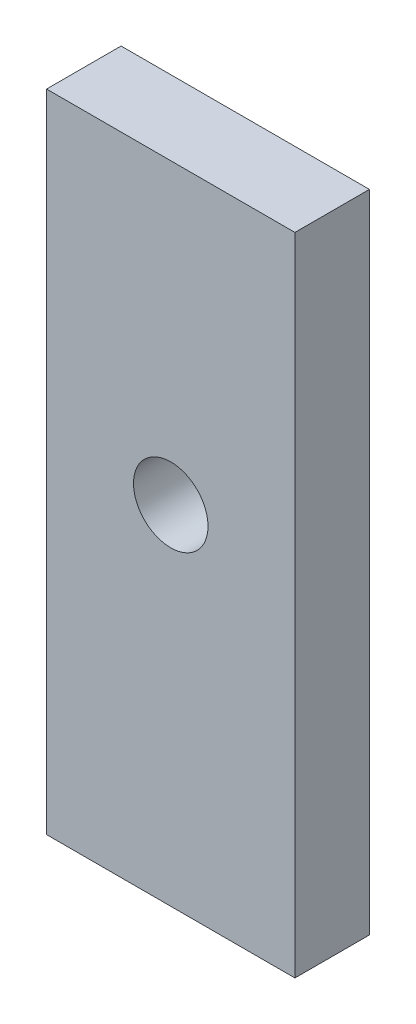
ISO-10303-21;
HEADER;
FILE_DESCRIPTION(('STEP AP214'),'2;1');
FILE_NAME('part.step','',(''),(''),'','','');
FILE_SCHEMA(('AUTOMOTIVE_DESIGN { 1 0 10303 214 1 1 1 1 }'));
ENDSEC;
DATA;
#1=APPLICATION_CONTEXT('core data for automotive mechanical design processes');
#2=APPLICATION_PROTOCOL_DEFINITION('international standard','automotive_design',2000,#1);
#3=PRODUCT_CONTEXT('',#1,'mechanical');
#4=PRODUCT('Part','Part','',(#3));
#5=PRODUCT_RELATED_PRODUCT_CATEGORY('part','',(#4));
#6=PRODUCT_DEFINITION_FORMATION('','',#4);
#7=PRODUCT_DEFINITION_CONTEXT('part definition',#1,'design');
#8=PRODUCT_DEFINITION('design','',#6,#7);
#9=PRODUCT_DEFINITION_SHAPE('','',#8);
#10=(LENGTH_UNIT() NAMED_UNIT(*) SI_UNIT(.MILLI.,.METRE.));
#11=(NAMED_UNIT(*) PLANE_ANGLE_UNIT() SI_UNIT($,.RADIAN.));
#12=(NAMED_UNIT(*) SI_UNIT($,.STERADIAN.) SOLID_ANGLE_UNIT());
#13=UNCERTAINTY_MEASURE_WITH_UNIT(LENGTH_MEASURE(1.E-05),#10,'distance_accuracy_value','');
#14=(GEOMETRIC_REPRESENTATION_CONTEXT(3) GLOBAL_UNCERTAINTY_ASSIGNED_CONTEXT((#13)) GLOBAL_UNIT_ASSIGNED_CONTEXT((#10,
#11,#12)) REPRESENTATION_CONTEXT('',''));
#15=CARTESIAN_POINT('',(0.,0.,0.));
#16=DIRECTION('',(0.,0.,1.));
#17=DIRECTION('',(1.,0.,0.));
#18=AXIS2_PLACEMENT_3D('',#15,#16,#17);
#19=CARTESIAN_POINT('',(0.,0.,3.));
#20=DIRECTION('',(1.,0.,0.));
#21=DIRECTION('',(0.,1.,0.));
#22=AXIS2_PLACEMENT_3D('',#19,#20,#21);
#23=PLANE('',#22);
#24=DIRECTION('',(0.,-1.,0.));
#25=VECTOR('',#24,1.);
#26=CARTESIAN_POINT('',(0.,0.,0.));
#27=LINE('',#26,#25);
#28=CARTESIAN_POINT('',(0.,26.,0.));
#29=VERTEX_POINT('',#28);
#30=CARTESIAN_POINT('',(0.,0.,0.));
#31=VERTEX_POINT('',#30);
#32=EDGE_CURVE('E98',#29,#31,#27,.T.);
#33=ORIENTED_EDGE('',*,*,#32,.T.);
#34=DIRECTION('',(0.,0.,-1.));
#35=VECTOR('',#34,1.);
#36=CARTESIAN_POINT('',(0.,0.,3.));
#37=LINE('',#36,#35);
#38=CARTESIAN_POINT('',(0.,0.,3.));
#39=VERTEX_POINT('',#38);
#40=EDGE_CURVE('E11',#39,#31,#37,.T.);
#41=ORIENTED_EDGE('',*,*,#40,.F.);
#42=DIRECTION('',(0.,-1.,0.));
#43=VECTOR('',#42,1.);
#44=CARTESIAN_POINT('',(0.,0.,3.));
#45=LINE('',#44,#43);
#46=CARTESIAN_POINT('',(0.,26.,3.));
#47=VERTEX_POINT('',#46);
#48=EDGE_CURVE('E86',#47,#39,#45,.T.);
#49=ORIENTED_EDGE('',*,*,#48,.F.);
#50=DIRECTION('',(0.,0.,-1.));
#51=VECTOR('',#50,1.);
#52=CARTESIAN_POINT('',(0.,26.,3.));
#53=LINE('',#52,#51);
#54=EDGE_CURVE('E94',#47,#29,#53,.T.);
#55=ORIENTED_EDGE('',*,*,#54,.T.);
#56=EDGE_LOOP('',(#33,#41,#49,#55));
#57=FACE_BOUND('',#56,.T.);
#58=ADVANCED_FACE('F35',(#57),#23,.F.);
#59=CARTESIAN_POINT('',(0.,0.,3.));
#60=DIRECTION('',(0.,1.,0.));
#61=DIRECTION('',(-1.,0.,0.));
#62=AXIS2_PLACEMENT_3D('',#59,#60,#61);
#63=PLANE('',#62);
#64=DIRECTION('',(1.,0.,0.));
#65=VECTOR('',#64,1.);
#66=CARTESIAN_POINT('',(0.,0.,0.));
#67=LINE('',#66,#65);
#68=CARTESIAN_POINT('',(9.99999999999999,0.,0.));
#69=VERTEX_POINT('',#68);
#70=EDGE_CURVE('E90',#31,#69,#67,.T.);
#71=ORIENTED_EDGE('',*,*,#70,.T.);
#72=DIRECTION('',(0.,0.,-1.));
#73=VECTOR('',#72,1.);
#74=CARTESIAN_POINT('',(9.99999999999999,0.,3.));
#75=LINE('',#74,#73);
#76=CARTESIAN_POINT('',(9.99999999999999,0.,3.));
#77=VERTEX_POINT('',#76);
#78=EDGE_CURVE('E43',#77,#69,#75,.T.);
#79=ORIENTED_EDGE('',*,*,#78,.F.);
#80=DIRECTION('',(1.,0.,0.));
#81=VECTOR('',#80,1.);
#82=CARTESIAN_POINT('',(0.,0.,3.));
#83=LINE('',#82,#81);
#84=EDGE_CURVE('E81',#39,#77,#83,.T.);
#85=ORIENTED_EDGE('',*,*,#84,.F.);
#86=ORIENTED_EDGE('',*,*,#40,.T.);
#87=EDGE_LOOP('',(#71,#79,#85,#86));
#88=FACE_BOUND('',#87,.T.);
#89=ADVANCED_FACE('F89',(#88),#63,.F.);
#90=CARTESIAN_POINT('',(9.99999999999999,0.,3.));
#91=DIRECTION('',(-1.,0.,0.));
#92=DIRECTION('',(0.,-1.,0.));
#93=AXIS2_PLACEMENT_3D('',#90,#91,#92);
#94=PLANE('',#93);
#95=DIRECTION('',(0.,1.,0.));
#96=VECTOR('',#95,1.);
#97=CARTESIAN_POINT('',(9.99999999999999,0.,0.));
#98=LINE('',#97,#96);
#99=CARTESIAN_POINT('',(9.99999999999999,26.,0.));
#100=VERTEX_POINT('',#99);
#101=EDGE_CURVE('E68',#69,#100,#98,.T.);
#102=ORIENTED_EDGE('',*,*,#101,.T.);
#103=DIRECTION('',(0.,0.,-1.));
#104=VECTOR('',#103,1.);
#105=CARTESIAN_POINT('',(9.99999999999999,26.,3.));
#106=LINE('',#105,#104);
#107=CARTESIAN_POINT('',(9.99999999999999,26.,3.));
#108=VERTEX_POINT('',#107);
#109=EDGE_CURVE('E91',#108,#100,#106,.T.);
#110=ORIENTED_EDGE('',*,*,#109,.F.);
#111=DIRECTION('',(0.,1.,0.));
#112=VECTOR('',#111,1.);
#113=CARTESIAN_POINT('',(9.99999999999999,0.,3.));
#114=LINE('',#113,#112);
#115=EDGE_CURVE('E84',#77,#108,#114,.T.);
#116=ORIENTED_EDGE('',*,*,#115,.F.);
#117=ORIENTED_EDGE('',*,*,#78,.T.);
#118=EDGE_LOOP('',(#102,#110,#116,#117));
#119=FACE_BOUND('',#118,.T.);
#120=ADVANCED_FACE('F92',(#119),#94,.F.);
#121=CARTESIAN_POINT('',(0.,26.,3.));
#122=DIRECTION('',(0.,-1.,0.));
#123=DIRECTION('',(0.,0.,-1.));
#124=AXIS2_PLACEMENT_3D('',#121,#122,#123);
#125=PLANE('',#124);
#126=DIRECTION('',(-1.,0.,0.));
#127=VECTOR('',#126,1.);
#128=CARTESIAN_POINT('',(0.,26.,0.));
#129=LINE('',#128,#127);
#130=EDGE_CURVE('E74',#100,#29,#129,.T.);
#131=ORIENTED_EDGE('',*,*,#130,.T.);
#132=ORIENTED_EDGE('',*,*,#54,.F.);
#133=DIRECTION('',(-1.,0.,0.));
#134=VECTOR('',#133,1.);
#135=CARTESIAN_POINT('',(0.,26.,3.));
#136=LINE('',#135,#134);
#137=EDGE_CURVE('E51',#108,#47,#136,.T.);
#138=ORIENTED_EDGE('',*,*,#137,.F.);
#139=ORIENTED_EDGE('',*,*,#109,.T.);
#140=EDGE_LOOP('',(#131,#132,#138,#139));
#141=FACE_BOUND('',#140,.T.);
#142=ADVANCED_FACE('F106',(#141),#125,.F.);
#143=CARTESIAN_POINT('',(0.,0.,3.));
#144=DIRECTION('',(0.,0.,-1.));
#145=DIRECTION('',(-1.,0.,0.));
#146=AXIS2_PLACEMENT_3D('',#143,#144,#145);
#147=PLANE('',#146);
#148=CARTESIAN_POINT('',(4.99999999999999,14.,3.));
#149=DIRECTION('',(0.,0.,1.));
#150=DIRECTION('',(1.,0.,0.));
#151=AXIS2_PLACEMENT_3D('',#148,#149,#150);
#152=CIRCLE('',#151,1.5);
#153=CARTESIAN_POINT('',(6.49999999999999,14.,3.));
#154=VERTEX_POINT('',#153);
#155=EDGE_CURVE('E112',#154,#154,#152,.T.);
#156=ORIENTED_EDGE('',*,*,#155,.F.);
#157=EDGE_LOOP('',(#156));
#158=FACE_BOUND('',#157,.T.);
#159=ORIENTED_EDGE('',*,*,#48,.T.);
#160=ORIENTED_EDGE('',*,*,#84,.T.);
#161=ORIENTED_EDGE('',*,*,#115,.T.);
#162=ORIENTED_EDGE('',*,*,#137,.T.);
#163=EDGE_LOOP('',(#159,#160,#161,#162));
#164=FACE_BOUND('',#163,.T.);
#165=ADVANCED_FACE('F82',(#158,#164),#147,.F.);
#166=CARTESIAN_POINT('',(0.,0.,0.));
#167=DIRECTION('',(0.,0.,-1.));
#168=DIRECTION('',(-1.,0.,0.));
#169=AXIS2_PLACEMENT_3D('',#166,#167,#168);
#170=PLANE('',#169);
#171=CARTESIAN_POINT('',(4.99999999999999,14.,0.));
#172=DIRECTION('',(0.,0.,1.));
#173=DIRECTION('',(1.,0.,0.));
#174=AXIS2_PLACEMENT_3D('',#171,#172,#173);
#175=CIRCLE('',#174,1.5);
#176=CARTESIAN_POINT('',(6.49999999999999,14.,0.));
#177=VERTEX_POINT('',#176);
#178=EDGE_CURVE('E101',#177,#177,#175,.T.);
#179=ORIENTED_EDGE('',*,*,#178,.T.);
#180=EDGE_LOOP('',(#179));
#181=FACE_BOUND('',#180,.T.);
#182=ORIENTED_EDGE('',*,*,#32,.F.);
#183=ORIENTED_EDGE('',*,*,#130,.F.);
#184=ORIENTED_EDGE('',*,*,#101,.F.);
#185=ORIENTED_EDGE('',*,*,#70,.F.);
#186=EDGE_LOOP('',(#182,#183,#184,#185));
#187=FACE_BOUND('',#186,.T.);
#188=ADVANCED_FACE('F109',(#181,#187),#170,.T.);
#189=CARTESIAN_POINT('',(4.99999999999999,14.,0.));
#190=DIRECTION('',(0.,0.,1.));
#191=DIRECTION('',(1.,0.,0.));
#192=AXIS2_PLACEMENT_3D('',#189,#190,#191);
#193=CYLINDRICAL_SURFACE('',#192,1.5);
#194=ORIENTED_EDGE('',*,*,#178,.F.);
#195=EDGE_LOOP('',(#194));
#196=FACE_BOUND('',#195,.T.);
#197=ORIENTED_EDGE('',*,*,#155,.T.);
#198=EDGE_LOOP('',(#197));
#199=FACE_BOUND('',#198,.T.);
#200=ADVANCED_FACE('F119',(#196,#199),#193,.F.);
#201=CLOSED_SHELL('',(#58,#89,#120,#142,#165,#188,#200));
#202=MANIFOLD_SOLID_BREP('B2',#201);
#203=ADVANCED_BREP_SHAPE_REPRESENTATION('',(#18,#202),#14);
#204=SHAPE_DEFINITION_REPRESENTATION(#9,#203);
ENDSEC;
END-ISO-10303-21;
